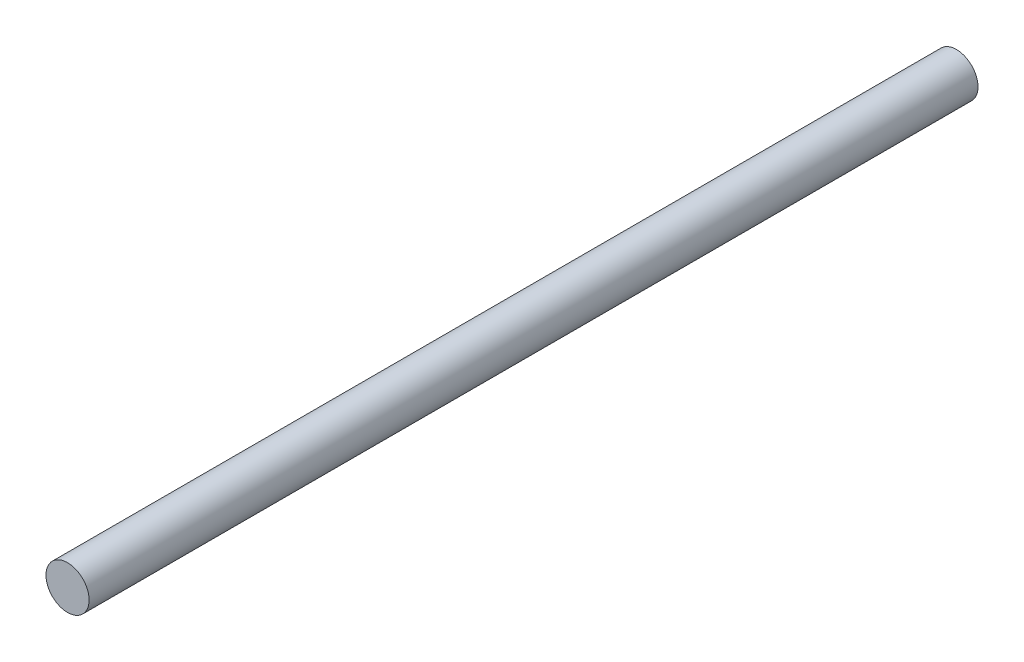
ISO-10303-21;
HEADER;
FILE_DESCRIPTION(('STEP AP214'),'2;1');
FILE_NAME('part.step','',(''),(''),'','','');
FILE_SCHEMA(('AUTOMOTIVE_DESIGN { 1 0 10303 214 1 1 1 1 }'));
ENDSEC;
DATA;
#1=APPLICATION_CONTEXT('core data for automotive mechanical design processes');
#2=APPLICATION_PROTOCOL_DEFINITION('international standard','automotive_design',2000,#1);
#3=PRODUCT_CONTEXT('',#1,'mechanical');
#4=PRODUCT('Part','Part','',(#3));
#5=PRODUCT_RELATED_PRODUCT_CATEGORY('part','',(#4));
#6=PRODUCT_DEFINITION_FORMATION('','',#4);
#7=PRODUCT_DEFINITION_CONTEXT('part definition',#1,'design');
#8=PRODUCT_DEFINITION('design','',#6,#7);
#9=PRODUCT_DEFINITION_SHAPE('','',#8);
#10=(LENGTH_UNIT() NAMED_UNIT(*) SI_UNIT(.MILLI.,.METRE.));
#11=(NAMED_UNIT(*) PLANE_ANGLE_UNIT() SI_UNIT($,.RADIAN.));
#12=(NAMED_UNIT(*) SI_UNIT($,.STERADIAN.) SOLID_ANGLE_UNIT());
#13=UNCERTAINTY_MEASURE_WITH_UNIT(LENGTH_MEASURE(1.E-05),#10,'distance_accuracy_value','');
#14=(GEOMETRIC_REPRESENTATION_CONTEXT(3) GLOBAL_UNCERTAINTY_ASSIGNED_CONTEXT((#13)) GLOBAL_UNIT_ASSIGNED_CONTEXT((#10,
#11,#12)) REPRESENTATION_CONTEXT('',''));
#15=CARTESIAN_POINT('',(0.,0.,0.));
#16=DIRECTION('',(0.,0.,1.));
#17=DIRECTION('',(1.,0.,0.));
#18=AXIS2_PLACEMENT_3D('',#15,#16,#17);
#19=CARTESIAN_POINT('',(0.,0.,103.));
#20=DIRECTION('',(0.,0.,-1.));
#21=DIRECTION('',(-1.,0.,0.));
#22=AXIS2_PLACEMENT_3D('',#19,#20,#21);
#23=CYLINDRICAL_SURFACE('',#22,2.5);
#24=CARTESIAN_POINT('',(0.,0.,103.));
#25=DIRECTION('',(0.,0.,1.));
#26=DIRECTION('',(1.,0.,0.));
#27=AXIS2_PLACEMENT_3D('',#24,#25,#26);
#28=CIRCLE('',#27,2.5);
#29=CARTESIAN_POINT('',(2.5,0.,103.));
#30=VERTEX_POINT('',#29);
#31=EDGE_CURVE('E10',#30,#30,#28,.T.);
#32=ORIENTED_EDGE('',*,*,#31,.F.);
#33=EDGE_LOOP('',(#32));
#34=FACE_BOUND('',#33,.T.);
#35=CARTESIAN_POINT('',(0.,0.,0.));
#36=DIRECTION('',(0.,0.,1.));
#37=DIRECTION('',(1.,0.,0.));
#38=AXIS2_PLACEMENT_3D('',#35,#36,#37);
#39=CIRCLE('',#38,2.5);
#40=CARTESIAN_POINT('',(2.5,0.,0.));
#41=VERTEX_POINT('',#40);
#42=EDGE_CURVE('E40',#41,#41,#39,.T.);
#43=ORIENTED_EDGE('',*,*,#42,.T.);
#44=EDGE_LOOP('',(#43));
#45=FACE_BOUND('',#44,.T.);
#46=ADVANCED_FACE('F37',(#34,#45),#23,.T.);
#47=CARTESIAN_POINT('',(0.,0.,103.));
#48=DIRECTION('',(0.,0.,1.));
#49=DIRECTION('',(1.,0.,0.));
#50=AXIS2_PLACEMENT_3D('',#47,#48,#49);
#51=PLANE('',#50);
#52=ORIENTED_EDGE('',*,*,#31,.T.);
#53=EDGE_LOOP('',(#52));
#54=FACE_BOUND('',#53,.T.);
#55=ADVANCED_FACE('F54',(#54),#51,.T.);
#56=CARTESIAN_POINT('',(0.,0.,0.));
#57=DIRECTION('',(0.,0.,1.));
#58=DIRECTION('',(1.,0.,0.));
#59=AXIS2_PLACEMENT_3D('',#56,#57,#58);
#60=PLANE('',#59);
#61=ORIENTED_EDGE('',*,*,#42,.F.);
#62=EDGE_LOOP('',(#61));
#63=FACE_BOUND('',#62,.T.);
#64=ADVANCED_FACE('F52',(#63),#60,.F.);
#65=CLOSED_SHELL('',(#46,#55,#64));
#66=MANIFOLD_SOLID_BREP('B2',#65);
#67=ADVANCED_BREP_SHAPE_REPRESENTATION('',(#18,#66),#14);
#68=SHAPE_DEFINITION_REPRESENTATION(#9,#67);
ENDSEC;
END-ISO-10303-21;
